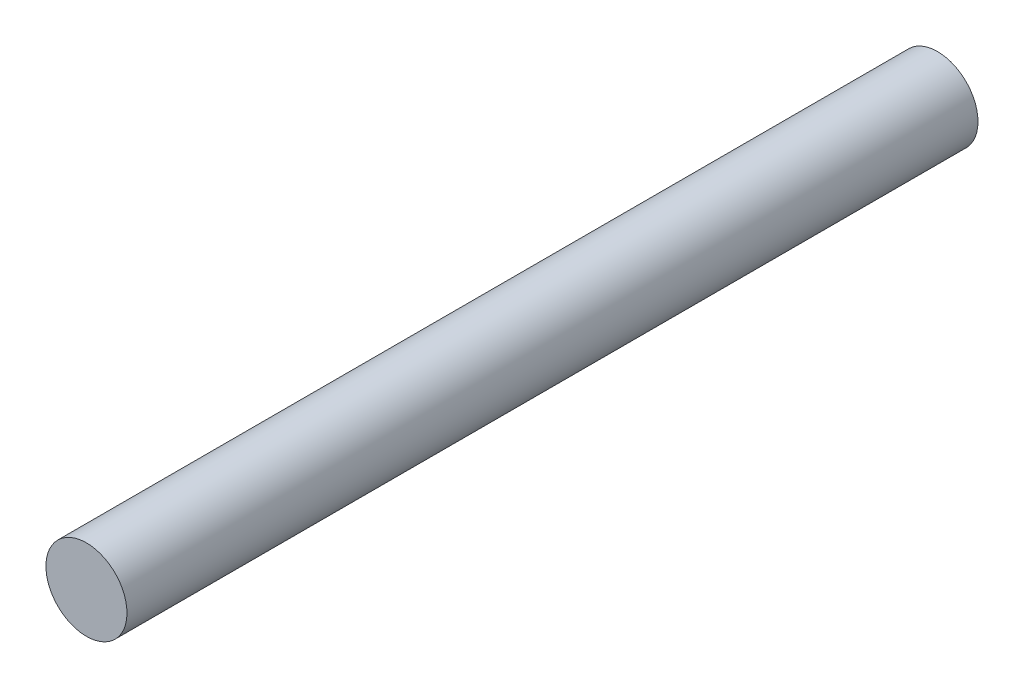
ISO-10303-21;
HEADER;
FILE_DESCRIPTION(('STEP AP214'),'2;1');
FILE_NAME('part.step','',(''),(''),'','','');
FILE_SCHEMA(('AUTOMOTIVE_DESIGN { 1 0 10303 214 1 1 1 1 }'));
ENDSEC;
DATA;
#1=APPLICATION_CONTEXT('core data for automotive mechanical design processes');
#2=APPLICATION_PROTOCOL_DEFINITION('international standard','automotive_design',2000,#1);
#3=PRODUCT_CONTEXT('',#1,'mechanical');
#4=PRODUCT('Part','Part','',(#3));
#5=PRODUCT_RELATED_PRODUCT_CATEGORY('part','',(#4));
#6=PRODUCT_DEFINITION_FORMATION('','',#4);
#7=PRODUCT_DEFINITION_CONTEXT('part definition',#1,'design');
#8=PRODUCT_DEFINITION('design','',#6,#7);
#9=PRODUCT_DEFINITION_SHAPE('','',#8);
#10=(LENGTH_UNIT() NAMED_UNIT(*) SI_UNIT(.MILLI.,.METRE.));
#11=(NAMED_UNIT(*) PLANE_ANGLE_UNIT() SI_UNIT($,.RADIAN.));
#12=(NAMED_UNIT(*) SI_UNIT($,.STERADIAN.) SOLID_ANGLE_UNIT());
#13=UNCERTAINTY_MEASURE_WITH_UNIT(LENGTH_MEASURE(1.E-05),#10,'distance_accuracy_value','');
#14=(GEOMETRIC_REPRESENTATION_CONTEXT(3) GLOBAL_UNCERTAINTY_ASSIGNED_CONTEXT((#13)) GLOBAL_UNIT_ASSIGNED_CONTEXT((#10,
#11,#12)) REPRESENTATION_CONTEXT('',''));
#15=CARTESIAN_POINT('',(0.,0.,0.));
#16=DIRECTION('',(0.,0.,1.));
#17=DIRECTION('',(1.,0.,0.));
#18=AXIS2_PLACEMENT_3D('',#15,#16,#17);
#19=CARTESIAN_POINT('',(0.,0.,210.));
#20=DIRECTION('',(0.,0.,-1.));
#21=DIRECTION('',(-1.,0.,0.));
#22=AXIS2_PLACEMENT_3D('',#19,#20,#21);
#23=CYLINDRICAL_SURFACE('',#22,10.);
#24=CARTESIAN_POINT('',(0.,0.,210.));
#25=DIRECTION('',(0.,0.,1.));
#26=DIRECTION('',(1.,0.,0.));
#27=AXIS2_PLACEMENT_3D('',#24,#25,#26);
#28=CIRCLE('',#27,10.);
#29=CARTESIAN_POINT('',(10.,0.,210.));
#30=VERTEX_POINT('',#29);
#31=EDGE_CURVE('E10',#30,#30,#28,.T.);
#32=ORIENTED_EDGE('',*,*,#31,.F.);
#33=EDGE_LOOP('',(#32));
#34=FACE_BOUND('',#33,.T.);
#35=CARTESIAN_POINT('',(0.,0.,0.));
#36=DIRECTION('',(0.,0.,1.));
#37=DIRECTION('',(1.,0.,0.));
#38=AXIS2_PLACEMENT_3D('',#35,#36,#37);
#39=CIRCLE('',#38,10.);
#40=CARTESIAN_POINT('',(10.,0.,0.));
#41=VERTEX_POINT('',#40);
#42=EDGE_CURVE('E36',#41,#41,#39,.T.);
#43=ORIENTED_EDGE('',*,*,#42,.T.);
#44=EDGE_LOOP('',(#43));
#45=FACE_BOUND('',#44,.T.);
#46=ADVANCED_FACE('F33',(#34,#45),#23,.T.);
#47=CARTESIAN_POINT('',(0.,0.,210.));
#48=DIRECTION('',(0.,0.,1.));
#49=DIRECTION('',(1.,0.,0.));
#50=AXIS2_PLACEMENT_3D('',#47,#48,#49);
#51=PLANE('',#50);
#52=ORIENTED_EDGE('',*,*,#31,.T.);
#53=EDGE_LOOP('',(#52));
#54=FACE_BOUND('',#53,.T.);
#55=ADVANCED_FACE('F48',(#54),#51,.T.);
#56=CARTESIAN_POINT('',(0.,0.,0.));
#57=DIRECTION('',(0.,0.,1.));
#58=DIRECTION('',(1.,0.,0.));
#59=AXIS2_PLACEMENT_3D('',#56,#57,#58);
#60=PLANE('',#59);
#61=ORIENTED_EDGE('',*,*,#42,.F.);
#62=EDGE_LOOP('',(#61));
#63=FACE_BOUND('',#62,.T.);
#64=ADVANCED_FACE('F46',(#63),#60,.F.);
#65=CLOSED_SHELL('',(#46,#55,#64));
#66=MANIFOLD_SOLID_BREP('B2',#65);
#67=ADVANCED_BREP_SHAPE_REPRESENTATION('',(#18,#66),#14);
#68=SHAPE_DEFINITION_REPRESENTATION(#9,#67);
ENDSEC;
END-ISO-10303-21;
